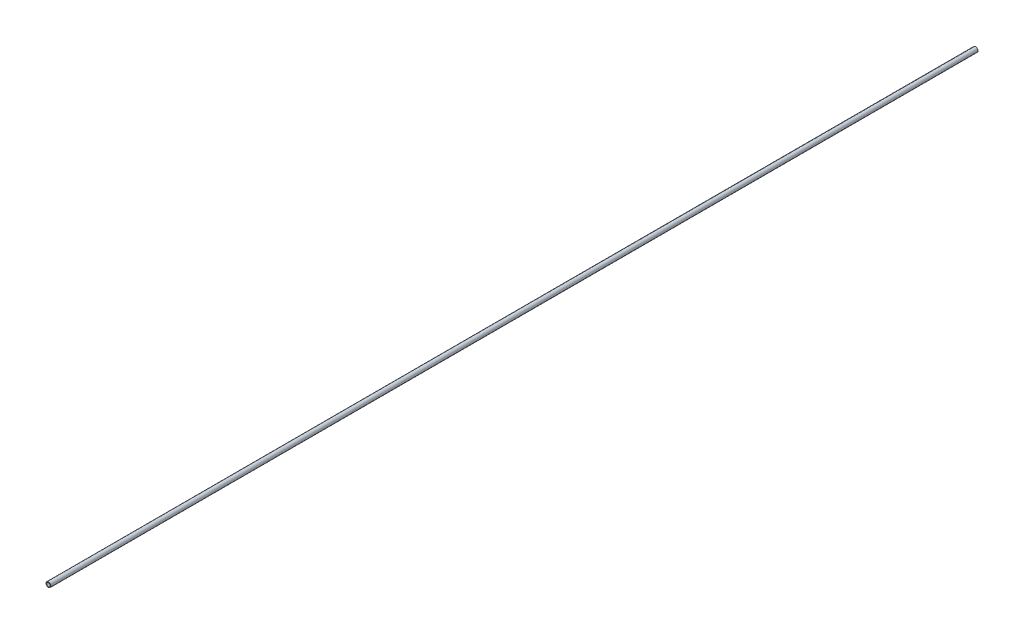
ISO-10303-21;
HEADER;
FILE_DESCRIPTION(('STEP AP214'),'2;1');
FILE_NAME('part.step','',(''),(''),'','','');
FILE_SCHEMA(('AUTOMOTIVE_DESIGN { 1 0 10303 214 1 1 1 1 }'));
ENDSEC;
DATA;
#1=APPLICATION_CONTEXT('core data for automotive mechanical design processes');
#2=APPLICATION_PROTOCOL_DEFINITION('international standard','automotive_design',2000,#1);
#3=PRODUCT_CONTEXT('',#1,'mechanical');
#4=PRODUCT('Part','Part','',(#3));
#5=PRODUCT_RELATED_PRODUCT_CATEGORY('part','',(#4));
#6=PRODUCT_DEFINITION_FORMATION('','',#4);
#7=PRODUCT_DEFINITION_CONTEXT('part definition',#1,'design');
#8=PRODUCT_DEFINITION('design','',#6,#7);
#9=PRODUCT_DEFINITION_SHAPE('','',#8);
#10=(LENGTH_UNIT() NAMED_UNIT(*) SI_UNIT(.MILLI.,.METRE.));
#11=(NAMED_UNIT(*) PLANE_ANGLE_UNIT() SI_UNIT($,.RADIAN.));
#12=(NAMED_UNIT(*) SI_UNIT($,.STERADIAN.) SOLID_ANGLE_UNIT());
#13=UNCERTAINTY_MEASURE_WITH_UNIT(LENGTH_MEASURE(1.E-05),#10,'distance_accuracy_value','');
#14=(GEOMETRIC_REPRESENTATION_CONTEXT(3) GLOBAL_UNCERTAINTY_ASSIGNED_CONTEXT((#13)) GLOBAL_UNIT_ASSIGNED_CONTEXT((#10,
#11,#12)) REPRESENTATION_CONTEXT('',''));
#15=CARTESIAN_POINT('',(0.,0.,0.));
#16=DIRECTION('',(0.,0.,1.));
#17=DIRECTION('',(1.,0.,0.));
#18=AXIS2_PLACEMENT_3D('',#15,#16,#17);
#19=CARTESIAN_POINT('',(0.,0.,2438.4));
#20=DIRECTION('',(0.,0.,1.));
#21=DIRECTION('',(1.,0.,0.));
#22=AXIS2_PLACEMENT_3D('',#19,#20,#21);
#23=PLANE('',#22);
#24=CARTESIAN_POINT('',(0.,0.,2438.4));
#25=DIRECTION('',(0.,0.,1.));
#26=DIRECTION('',(1.,0.,0.));
#27=AXIS2_PLACEMENT_3D('',#24,#25,#26);
#28=CIRCLE('',#27,6.35);
#29=CARTESIAN_POINT('',(-6.35,0.,2438.4));
#30=VERTEX_POINT('',#29);
#31=EDGE_CURVE('E10',#30,#30,#28,.T.);
#32=ORIENTED_EDGE('',*,*,#31,.T.);
#33=EDGE_LOOP('',(#32));
#34=FACE_BOUND('',#33,.T.);
#35=CARTESIAN_POINT('',(0.,0.,2438.4));
#36=DIRECTION('',(0.,0.,1.));
#37=DIRECTION('',(1.,0.,0.));
#38=AXIS2_PLACEMENT_3D('',#35,#36,#37);
#39=CIRCLE('',#38,4.7625);
#40=CARTESIAN_POINT('',(-4.7625,0.,2438.4));
#41=VERTEX_POINT('',#40);
#42=EDGE_CURVE('E46',#41,#41,#39,.T.);
#43=ORIENTED_EDGE('',*,*,#42,.F.);
#44=EDGE_LOOP('',(#43));
#45=FACE_BOUND('',#44,.T.);
#46=ADVANCED_FACE('F35',(#34,#45),#23,.T.);
#47=CARTESIAN_POINT('',(0.,0.,0.));
#48=DIRECTION('',(0.,0.,1.));
#49=DIRECTION('',(1.,0.,0.));
#50=AXIS2_PLACEMENT_3D('',#47,#48,#49);
#51=PLANE('',#50);
#52=CARTESIAN_POINT('',(0.,0.,0.));
#53=DIRECTION('',(0.,0.,1.));
#54=DIRECTION('',(1.,0.,0.));
#55=AXIS2_PLACEMENT_3D('',#52,#53,#54);
#56=CIRCLE('',#55,6.35);
#57=CARTESIAN_POINT('',(-6.35,0.,0.));
#58=VERTEX_POINT('',#57);
#59=EDGE_CURVE('E39',#58,#58,#56,.T.);
#60=ORIENTED_EDGE('',*,*,#59,.F.);
#61=EDGE_LOOP('',(#60));
#62=FACE_BOUND('',#61,.T.);
#63=CARTESIAN_POINT('',(0.,0.,0.));
#64=DIRECTION('',(0.,0.,1.));
#65=DIRECTION('',(1.,0.,0.));
#66=AXIS2_PLACEMENT_3D('',#63,#64,#65);
#67=CIRCLE('',#66,4.7625);
#68=CARTESIAN_POINT('',(-4.7625,0.,0.));
#69=VERTEX_POINT('',#68);
#70=EDGE_CURVE('E48',#69,#69,#67,.T.);
#71=ORIENTED_EDGE('',*,*,#70,.T.);
#72=EDGE_LOOP('',(#71));
#73=FACE_BOUND('',#72,.T.);
#74=ADVANCED_FACE('F58',(#62,#73),#51,.F.);
#75=CARTESIAN_POINT('',(0.,0.,2438.4));
#76=DIRECTION('',(0.,0.,-1.));
#77=DIRECTION('',(-1.,0.,0.));
#78=AXIS2_PLACEMENT_3D('',#75,#76,#77);
#79=CYLINDRICAL_SURFACE('',#78,6.35);
#80=CARTESIAN_POINT('',(-6.35,0.,2438.4));
#81=CARTESIAN_POINT('',(-6.35,0.,2413.));
#82=CARTESIAN_POINT('',(-6.35,0.,2387.6));
#83=CARTESIAN_POINT('',(-6.35,0.,2336.8));
#84=CARTESIAN_POINT('',(-6.35,0.,2311.4));
#85=CARTESIAN_POINT('',(-6.35,0.,2260.6));
#86=CARTESIAN_POINT('',(-6.35,0.,2235.2));
#87=CARTESIAN_POINT('',(-6.35,0.,2184.4));
#88=CARTESIAN_POINT('',(-6.35,0.,2159.));
#89=CARTESIAN_POINT('',(-6.35,0.,2108.2));
#90=CARTESIAN_POINT('',(-6.35,0.,2082.8));
#91=CARTESIAN_POINT('',(-6.35,0.,2032.));
#92=CARTESIAN_POINT('',(-6.35,0.,2006.6));
#93=CARTESIAN_POINT('',(-6.35,0.,1955.8));
#94=CARTESIAN_POINT('',(-6.35,0.,1930.4));
#95=CARTESIAN_POINT('',(-6.35,0.,1879.6));
#96=CARTESIAN_POINT('',(-6.35,0.,1854.2));
#97=CARTESIAN_POINT('',(-6.35,0.,1803.4));
#98=CARTESIAN_POINT('',(-6.35,0.,1778.));
#99=CARTESIAN_POINT('',(-6.35,0.,1727.2));
#100=CARTESIAN_POINT('',(-6.35,0.,1701.8));
#101=CARTESIAN_POINT('',(-6.35,0.,1651.));
#102=CARTESIAN_POINT('',(-6.35,0.,1625.6));
#103=CARTESIAN_POINT('',(-6.35,0.,1574.8));
#104=CARTESIAN_POINT('',(-6.35,0.,1549.4));
#105=CARTESIAN_POINT('',(-6.35,0.,1498.6));
#106=CARTESIAN_POINT('',(-6.35,0.,1473.2));
#107=CARTESIAN_POINT('',(-6.35,0.,1422.4));
#108=CARTESIAN_POINT('',(-6.35,0.,1397.));
#109=CARTESIAN_POINT('',(-6.35,0.,1346.2));
#110=CARTESIAN_POINT('',(-6.35,0.,1320.8));
#111=CARTESIAN_POINT('',(-6.35,0.,1270.));
#112=CARTESIAN_POINT('',(-6.35,0.,1244.6));
#113=CARTESIAN_POINT('',(-6.35,0.,1193.8));
#114=CARTESIAN_POINT('',(-6.35,0.,1168.4));
#115=CARTESIAN_POINT('',(-6.35,0.,1117.6));
#116=CARTESIAN_POINT('',(-6.35,0.,1092.2));
#117=CARTESIAN_POINT('',(-6.35,0.,1041.4));
#118=CARTESIAN_POINT('',(-6.35,0.,1016.));
#119=CARTESIAN_POINT('',(-6.35,0.,965.2));
#120=CARTESIAN_POINT('',(-6.35,0.,939.8));
#121=CARTESIAN_POINT('',(-6.35,0.,889.));
#122=CARTESIAN_POINT('',(-6.35,0.,863.6));
#123=CARTESIAN_POINT('',(-6.35,0.,812.8));
#124=CARTESIAN_POINT('',(-6.35,0.,787.4));
#125=CARTESIAN_POINT('',(-6.35,0.,736.6));
#126=CARTESIAN_POINT('',(-6.35,0.,711.2));
#127=CARTESIAN_POINT('',(-6.35,0.,660.4));
#128=CARTESIAN_POINT('',(-6.35,0.,635.));
#129=CARTESIAN_POINT('',(-6.35,0.,584.2));
#130=CARTESIAN_POINT('',(-6.35,0.,558.8));
#131=CARTESIAN_POINT('',(-6.35,0.,508.));
#132=CARTESIAN_POINT('',(-6.35,0.,482.6));
#133=CARTESIAN_POINT('',(-6.35,0.,431.8));
#134=CARTESIAN_POINT('',(-6.35,0.,406.4));
#135=CARTESIAN_POINT('',(-6.35,0.,355.6));
#136=CARTESIAN_POINT('',(-6.35,0.,330.2));
#137=CARTESIAN_POINT('',(-6.35,0.,279.4));
#138=CARTESIAN_POINT('',(-6.35,0.,254.));
#139=CARTESIAN_POINT('',(-6.35,0.,203.2));
#140=CARTESIAN_POINT('',(-6.35,0.,177.8));
#141=CARTESIAN_POINT('',(-6.35,0.,127.));
#142=CARTESIAN_POINT('',(-6.35,0.,101.6));
#143=CARTESIAN_POINT('',(-6.35,0.,50.8));
#144=CARTESIAN_POINT('',(-6.35,0.,25.4));
#145=CARTESIAN_POINT('',(-6.35,0.,0.));
#146=B_SPLINE_CURVE_WITH_KNOTS('',3,(#80,#81,#82,#83,#84,#85,#86,#87,#88,#89,#90,#91,#92,#93,
#94,#95,#96,#97,#98,#99,#100,#101,#102,#103,#104,#105,#106,#107,#108,#109,#110,#111,#112,#113,
#114,#115,#116,#117,#118,#119,#120,#121,#122,#123,#124,#125,#126,#127,#128,#129,#130,#131,#132,
#133,#134,#135,#136,#137,#138,#139,#140,#141,#142,#143,#144,#145),.UNSPECIFIED.,.F.,.F.,(4,2,2,
2,2,2,2,2,2,2,2,2,2,2,2,2,2,2,2,2,2,2,2,2,2,2,2,2,2,2,2,2,4),(0.,76.2,152.4,228.6,304.8,381.,
457.2,533.4,609.6,685.8,762.,838.2,914.4,990.6,1066.8,1143.,1219.2,1295.4,1371.6,1447.8,1524.,
1600.2,1676.4,1752.6,1828.8,1905.,1981.2,2057.4,2133.6,2209.8,2286.,2362.2,2438.4),.UNSPECIFIED.);
#147=EDGE_CURVE('BSEAM37',#30,#58,#146,.T.);
#148=ORIENTED_EDGE('',*,*,#31,.F.);
#149=ORIENTED_EDGE('',*,*,#59,.T.);
#150=ORIENTED_EDGE('',*,*,#147,.T.);
#151=ORIENTED_EDGE('',*,*,#147,.F.);
#152=EDGE_LOOP('',(#148,#150,#149,#151));
#153=FACE_BOUND('',#152,.T.);
#154=ADVANCED_FACE('F37',(#153),#79,.T.);
#155=CARTESIAN_POINT('',(0.,0.,2438.4));
#156=DIRECTION('',(0.,0.,-1.));
#157=DIRECTION('',(-1.,0.,0.));
#158=AXIS2_PLACEMENT_3D('',#155,#156,#157);
#159=CYLINDRICAL_SURFACE('',#158,4.7625);
#160=CARTESIAN_POINT('',(-4.7625,0.,2438.4));
#161=CARTESIAN_POINT('',(-4.7625,0.,2413.));
#162=CARTESIAN_POINT('',(-4.7625,0.,2387.6));
#163=CARTESIAN_POINT('',(-4.7625,0.,2336.8));
#164=CARTESIAN_POINT('',(-4.7625,0.,2311.4));
#165=CARTESIAN_POINT('',(-4.7625,0.,2260.6));
#166=CARTESIAN_POINT('',(-4.7625,0.,2235.2));
#167=CARTESIAN_POINT('',(-4.7625,0.,2184.4));
#168=CARTESIAN_POINT('',(-4.7625,0.,2159.));
#169=CARTESIAN_POINT('',(-4.7625,0.,2108.2));
#170=CARTESIAN_POINT('',(-4.7625,0.,2082.8));
#171=CARTESIAN_POINT('',(-4.7625,0.,2032.));
#172=CARTESIAN_POINT('',(-4.7625,0.,2006.6));
#173=CARTESIAN_POINT('',(-4.7625,0.,1955.8));
#174=CARTESIAN_POINT('',(-4.7625,0.,1930.4));
#175=CARTESIAN_POINT('',(-4.7625,0.,1879.6));
#176=CARTESIAN_POINT('',(-4.7625,0.,1854.2));
#177=CARTESIAN_POINT('',(-4.7625,0.,1803.4));
#178=CARTESIAN_POINT('',(-4.7625,0.,1778.));
#179=CARTESIAN_POINT('',(-4.7625,0.,1727.2));
#180=CARTESIAN_POINT('',(-4.7625,0.,1701.8));
#181=CARTESIAN_POINT('',(-4.7625,0.,1651.));
#182=CARTESIAN_POINT('',(-4.7625,0.,1625.6));
#183=CARTESIAN_POINT('',(-4.7625,0.,1574.8));
#184=CARTESIAN_POINT('',(-4.7625,0.,1549.4));
#185=CARTESIAN_POINT('',(-4.7625,0.,1498.6));
#186=CARTESIAN_POINT('',(-4.7625,0.,1473.2));
#187=CARTESIAN_POINT('',(-4.7625,0.,1422.4));
#188=CARTESIAN_POINT('',(-4.7625,0.,1397.));
#189=CARTESIAN_POINT('',(-4.7625,0.,1346.2));
#190=CARTESIAN_POINT('',(-4.7625,0.,1320.8));
#191=CARTESIAN_POINT('',(-4.7625,0.,1270.));
#192=CARTESIAN_POINT('',(-4.7625,0.,1244.6));
#193=CARTESIAN_POINT('',(-4.7625,0.,1193.8));
#194=CARTESIAN_POINT('',(-4.7625,0.,1168.4));
#195=CARTESIAN_POINT('',(-4.7625,0.,1117.6));
#196=CARTESIAN_POINT('',(-4.7625,0.,1092.2));
#197=CARTESIAN_POINT('',(-4.7625,0.,1041.4));
#198=CARTESIAN_POINT('',(-4.7625,0.,1016.));
#199=CARTESIAN_POINT('',(-4.7625,0.,965.2));
#200=CARTESIAN_POINT('',(-4.7625,0.,939.8));
#201=CARTESIAN_POINT('',(-4.7625,0.,889.));
#202=CARTESIAN_POINT('',(-4.7625,0.,863.6));
#203=CARTESIAN_POINT('',(-4.7625,0.,812.8));
#204=CARTESIAN_POINT('',(-4.7625,0.,787.4));
#205=CARTESIAN_POINT('',(-4.7625,0.,736.6));
#206=CARTESIAN_POINT('',(-4.7625,0.,711.2));
#207=CARTESIAN_POINT('',(-4.7625,0.,660.4));
#208=CARTESIAN_POINT('',(-4.7625,0.,635.));
#209=CARTESIAN_POINT('',(-4.7625,0.,584.2));
#210=CARTESIAN_POINT('',(-4.7625,0.,558.8));
#211=CARTESIAN_POINT('',(-4.7625,0.,508.));
#212=CARTESIAN_POINT('',(-4.7625,0.,482.6));
#213=CARTESIAN_POINT('',(-4.7625,0.,431.8));
#214=CARTESIAN_POINT('',(-4.7625,0.,406.4));
#215=CARTESIAN_POINT('',(-4.7625,0.,355.6));
#216=CARTESIAN_POINT('',(-4.7625,0.,330.2));
#217=CARTESIAN_POINT('',(-4.7625,0.,279.4));
#218=CARTESIAN_POINT('',(-4.7625,0.,254.));
#219=CARTESIAN_POINT('',(-4.7625,0.,203.2));
#220=CARTESIAN_POINT('',(-4.7625,0.,177.8));
#221=CARTESIAN_POINT('',(-4.7625,0.,127.));
#222=CARTESIAN_POINT('',(-4.7625,0.,101.6));
#223=CARTESIAN_POINT('',(-4.7625,0.,50.8));
#224=CARTESIAN_POINT('',(-4.7625,0.,25.4));
#225=CARTESIAN_POINT('',(-4.7625,0.,0.));
#226=B_SPLINE_CURVE_WITH_KNOTS('',3,(#160,#161,#162,#163,#164,#165,#166,#167,#168,#169,#170,
#171,#172,#173,#174,#175,#176,#177,#178,#179,#180,#181,#182,#183,#184,#185,#186,#187,#188,#189,
#190,#191,#192,#193,#194,#195,#196,#197,#198,#199,#200,#201,#202,#203,#204,#205,#206,#207,#208,
#209,#210,#211,#212,#213,#214,#215,#216,#217,#218,#219,#220,#221,#222,#223,#224,#225),
.UNSPECIFIED.,.F.,.F.,(4,2,2,2,2,2,2,2,2,2,2,2,2,2,2,2,2,2,2,2,2,2,2,2,2,2,2,2,2,2,2,2,4),(0.,
76.1999999999996,152.4,228.6,304.8,381.,457.2,533.4,609.6,685.8,762.,838.2,914.4,990.6,1066.8,
1143.,1219.2,1295.4,1371.6,1447.8,1524.,1600.2,1676.4,1752.6,1828.8,1905.,1981.2,2057.4,2133.6,
2209.8,2286.,2362.2,2438.4),.UNSPECIFIED.);
#227=EDGE_CURVE('BSEAM54',#41,#69,#226,.T.);
#228=ORIENTED_EDGE('',*,*,#42,.T.);
#229=ORIENTED_EDGE('',*,*,#70,.F.);
#230=ORIENTED_EDGE('',*,*,#227,.T.);
#231=ORIENTED_EDGE('',*,*,#227,.F.);
#232=EDGE_LOOP('',(#228,#230,#229,#231));
#233=FACE_BOUND('',#232,.T.);
#234=ADVANCED_FACE('F54',(#233),#159,.F.);
#235=CLOSED_SHELL('',(#46,#74,#154,#234));
#236=MANIFOLD_SOLID_BREP('B2',#235);
#237=ADVANCED_BREP_SHAPE_REPRESENTATION('',(#18,#236),#14);
#238=SHAPE_DEFINITION_REPRESENTATION(#9,#237);
ENDSEC;
END-ISO-10303-21;
